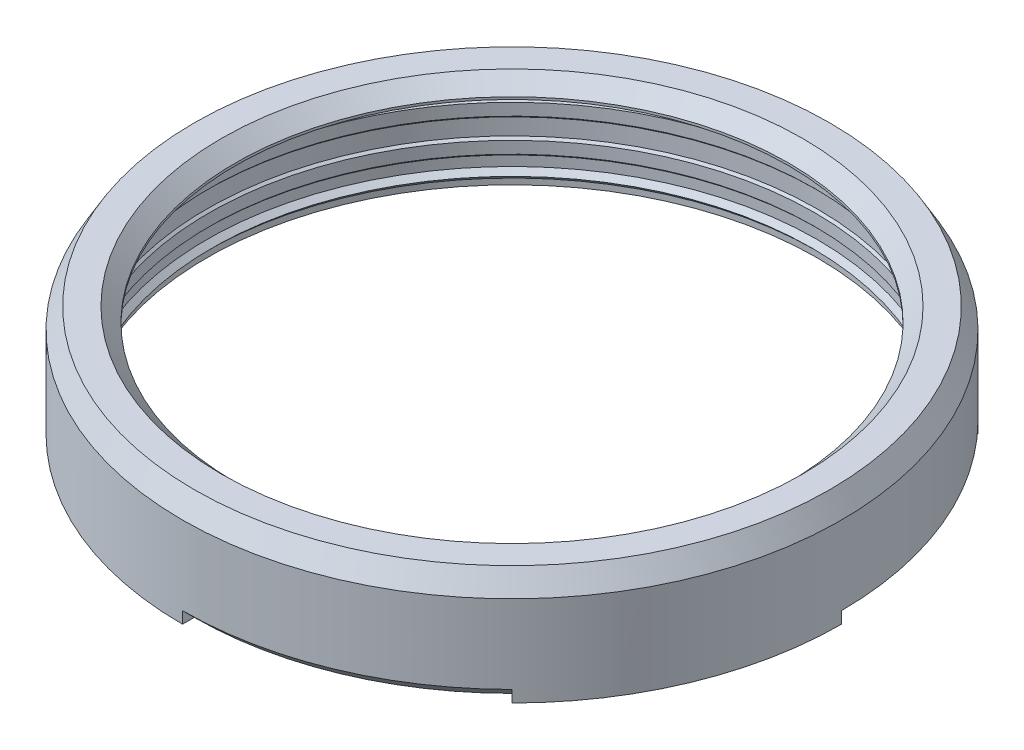
ISO-10303-21;
HEADER;
FILE_DESCRIPTION(('STEP AP214'),'2;1');
FILE_NAME('part.step','',(''),(''),'','','');
FILE_SCHEMA(('AUTOMOTIVE_DESIGN { 1 0 10303 214 1 1 1 1 }'));
ENDSEC;
DATA;
#1=APPLICATION_CONTEXT('core data for automotive mechanical design processes');
#2=APPLICATION_PROTOCOL_DEFINITION('international standard','automotive_design',2000,#1);
#3=PRODUCT_CONTEXT('',#1,'mechanical');
#4=PRODUCT('Part','Part','',(#3));
#5=PRODUCT_RELATED_PRODUCT_CATEGORY('part','',(#4));
#6=PRODUCT_DEFINITION_FORMATION('','',#4);
#7=PRODUCT_DEFINITION_CONTEXT('part definition',#1,'design');
#8=PRODUCT_DEFINITION('design','',#6,#7);
#9=PRODUCT_DEFINITION_SHAPE('','',#8);
#10=(LENGTH_UNIT() NAMED_UNIT(*) SI_UNIT(.MILLI.,.METRE.));
#11=(NAMED_UNIT(*) PLANE_ANGLE_UNIT() SI_UNIT($,.RADIAN.));
#12=(NAMED_UNIT(*) SI_UNIT($,.STERADIAN.) SOLID_ANGLE_UNIT());
#13=UNCERTAINTY_MEASURE_WITH_UNIT(LENGTH_MEASURE(1.E-05),#10,'distance_accuracy_value','');
#14=(GEOMETRIC_REPRESENTATION_CONTEXT(3) GLOBAL_UNCERTAINTY_ASSIGNED_CONTEXT((#13)) GLOBAL_UNIT_ASSIGNED_CONTEXT((#10,
#11,#12)) REPRESENTATION_CONTEXT('',''));
#15=CARTESIAN_POINT('',(0.,0.,0.));
#16=DIRECTION('',(0.,0.,1.));
#17=DIRECTION('',(1.,0.,0.));
#18=AXIS2_PLACEMENT_3D('',#15,#16,#17);
#19=CARTESIAN_POINT('',(0.,-1.39999999999982,0.));
#20=DIRECTION('',(0.,-1.,0.));
#21=DIRECTION('',(0.,0.,-1.));
#22=AXIS2_PLACEMENT_3D('',#19,#20,#21);
#23=TOROIDAL_SURFACE('',#22,24.5300000000004,1.39999999999979);
#24=CARTESIAN_POINT('',(0.,-1.39999999999982,0.));
#25=DIRECTION('',(0.,-1.,0.));
#26=DIRECTION('',(0.,0.,-1.));
#27=AXIS2_PLACEMENT_3D('',#24,#25,#26);
#28=CIRCLE('',#27,25.9300000000002);
#29=CARTESIAN_POINT('',(0.,-1.39999999999982,-25.9300000000002));
#30=VERTEX_POINT('',#29);
#31=EDGE_CURVE('E221',#30,#30,#28,.T.);
#32=ORIENTED_EDGE('',*,*,#31,.T.);
#33=EDGE_LOOP('',(#32));
#34=FACE_BOUND('',#33,.T.);
#35=CARTESIAN_POINT('',(0.,-0.0225022686043711,0.));
#36=DIRECTION('',(0.,-1.,0.));
#37=DIRECTION('',(0.,0.,-1.));
#38=AXIS2_PLACEMENT_3D('',#35,#36,#37);
#39=CIRCLE('',#38,24.78);
#40=CARTESIAN_POINT('',(0.,-0.0225022686043708,-24.78));
#41=VERTEX_POINT('',#40);
#42=EDGE_CURVE('E44',#41,#41,#39,.F.);
#43=ORIENTED_EDGE('',*,*,#42,.T.);
#44=EDGE_LOOP('',(#43));
#45=FACE_BOUND('',#44,.T.);
#46=ADVANCED_FACE('F39',(#34,#45),#23,.F.);
#47=CARTESIAN_POINT('',(0.,0.,0.));
#48=DIRECTION('',(0.,1.,0.));
#49=DIRECTION('',(0.,0.,1.));
#50=AXIS2_PLACEMENT_3D('',#47,#48,#49);
#51=PLANE('',#50);
#52=CARTESIAN_POINT('',(0.,0.,0.));
#53=DIRECTION('',(0.,1.,0.));
#54=DIRECTION('',(0.,0.,1.));
#55=AXIS2_PLACEMENT_3D('',#52,#53,#54);
#56=CIRCLE('',#55,23.5);
#57=CARTESIAN_POINT('',(0.,0.,23.5));
#58=VERTEX_POINT('',#57);
#59=EDGE_CURVE('E220',#58,#58,#56,.T.);
#60=ORIENTED_EDGE('',*,*,#59,.T.);
#61=EDGE_LOOP('',(#60));
#62=FACE_BOUND('',#61,.T.);
#63=CARTESIAN_POINT('',(0.,0.,0.));
#64=DIRECTION('',(0.,-1.,0.));
#65=DIRECTION('',(0.,0.,-1.));
#66=AXIS2_PLACEMENT_3D('',#63,#64,#65);
#67=CIRCLE('',#66,24.32);
#68=CARTESIAN_POINT('',(0.,0.,-24.32));
#69=VERTEX_POINT('',#68);
#70=EDGE_CURVE('E404',#69,#69,#67,.T.);
#71=ORIENTED_EDGE('',*,*,#70,.T.);
#72=EDGE_LOOP('',(#71));
#73=FACE_BOUND('',#72,.T.);
#74=ADVANCED_FACE('F293',(#62,#73),#51,.F.);
#75=CARTESIAN_POINT('',(0.,2.,0.));
#76=DIRECTION('',(0.,-1.,0.));
#77=DIRECTION('',(0.,0.,-1.));
#78=AXIS2_PLACEMENT_3D('',#75,#76,#77);
#79=CYLINDRICAL_SURFACE('',#78,28.);
#80=CARTESIAN_POINT('',(0.,-0.331999999999997,0.));
#81=DIRECTION('',(0.,1.,0.));
#82=DIRECTION('',(0.,0.,1.));
#83=AXIS2_PLACEMENT_3D('',#80,#81,#82);
#84=CIRCLE('',#83,28.);
#85=CARTESIAN_POINT('',(0.,-0.331999999999997,28.));
#86=VERTEX_POINT('',#85);
#87=EDGE_CURVE('E11',#86,#86,#84,.F.);
#88=ORIENTED_EDGE('',*,*,#87,.T.);
#89=EDGE_LOOP('',(#88));
#90=FACE_BOUND('',#89,.T.);
#91=DIRECTION('',(0.,1.,0.));
#92=VECTOR('',#91,1.);
#93=CARTESIAN_POINT('',(-19.7989898732232,-7.99999999999999,-19.7989898732235));
#94=LINE('',#93,#92);
#95=CARTESIAN_POINT('',(-19.7989898732232,-7.99999999999999,-19.7989898732235));
#96=VERTEX_POINT('',#95);
#97=CARTESIAN_POINT('',(-19.7989898732232,-6.99999999999999,-19.7989898732235));
#98=VERTEX_POINT('',#97);
#99=EDGE_CURVE('E136',#96,#98,#94,.T.);
#100=ORIENTED_EDGE('',*,*,#99,.F.);
#101=CARTESIAN_POINT('',(0.,-7.99999999999999,0.));
#102=DIRECTION('',(0.,-1.,0.));
#103=DIRECTION('',(0.,0.,-1.));
#104=AXIS2_PLACEMENT_3D('',#101,#102,#103);
#105=CIRCLE('',#104,28.0000000000001);
#106=CARTESIAN_POINT('',(-28.0000000000001,-7.99999999999999,0.));
#107=VERTEX_POINT('',#106);
#108=EDGE_CURVE('E371',#107,#96,#105,.T.);
#109=ORIENTED_EDGE('',*,*,#108,.F.);
#110=DIRECTION('',(0.,1.,0.));
#111=VECTOR('',#110,1.);
#112=CARTESIAN_POINT('',(-28.,-7.99999999999999,0.));
#113=LINE('',#112,#111);
#114=CARTESIAN_POINT('',(-28.,-6.99999999999999,0.));
#115=VERTEX_POINT('',#114);
#116=EDGE_CURVE('E64',#107,#115,#113,.T.);
#117=ORIENTED_EDGE('',*,*,#116,.T.);
#118=CARTESIAN_POINT('',(0.,-6.99999999999999,0.));
#119=DIRECTION('',(0.,-1.,0.));
#120=DIRECTION('',(0.,0.,1.));
#121=AXIS2_PLACEMENT_3D('',#118,#119,#120);
#122=CIRCLE('',#121,28.);
#123=CARTESIAN_POINT('',(-19.7989898732233,-6.99999999999999,19.7989898732234));
#124=VERTEX_POINT('',#123);
#125=EDGE_CURVE('E144',#124,#115,#122,.T.);
#126=ORIENTED_EDGE('',*,*,#125,.F.);
#127=DIRECTION('',(0.,1.,0.));
#128=VECTOR('',#127,1.);
#129=CARTESIAN_POINT('',(-19.7989898732233,-7.99999999999999,19.7989898732234));
#130=LINE('',#129,#128);
#131=CARTESIAN_POINT('',(-19.7989898732233,-7.99999999999999,19.7989898732234));
#132=VERTEX_POINT('',#131);
#133=EDGE_CURVE('E150',#132,#124,#130,.T.);
#134=ORIENTED_EDGE('',*,*,#133,.F.);
#135=CARTESIAN_POINT('',(0.,-7.99999999999999,28.0000000000001));
#136=VERTEX_POINT('',#135);
#137=EDGE_CURVE('E265',#136,#132,#105,.T.);
#138=ORIENTED_EDGE('',*,*,#137,.F.);
#139=DIRECTION('',(0.,1.,0.));
#140=VECTOR('',#139,1.);
#141=CARTESIAN_POINT('',(0.,-7.99999999999999,28.));
#142=LINE('',#141,#140);
#143=CARTESIAN_POINT('',(0.,-6.99999999999999,28.));
#144=VERTEX_POINT('',#143);
#145=EDGE_CURVE('E182',#136,#144,#142,.T.);
#146=ORIENTED_EDGE('',*,*,#145,.T.);
#147=CARTESIAN_POINT('',(0.,-6.99999999999999,0.));
#148=DIRECTION('',(0.,-1.,0.));
#149=DIRECTION('',(1.,0.,0.));
#150=AXIS2_PLACEMENT_3D('',#147,#148,#149);
#151=CIRCLE('',#150,28.);
#152=CARTESIAN_POINT('',(19.7989898732233,-6.99999999999999,19.7989898732234));
#153=VERTEX_POINT('',#152);
#154=EDGE_CURVE('E187',#153,#144,#151,.T.);
#155=ORIENTED_EDGE('',*,*,#154,.F.);
#156=DIRECTION('',(0.,1.,0.));
#157=VECTOR('',#156,1.);
#158=CARTESIAN_POINT('',(19.7989898732233,-7.99999999999999,19.7989898732234));
#159=LINE('',#158,#157);
#160=CARTESIAN_POINT('',(19.7989898732233,-7.99999999999999,19.7989898732234));
#161=VERTEX_POINT('',#160);
#162=EDGE_CURVE('E195',#161,#153,#159,.T.);
#163=ORIENTED_EDGE('',*,*,#162,.F.);
#164=CARTESIAN_POINT('',(28.0000000000001,-7.99999999999999,0.));
#165=VERTEX_POINT('',#164);
#166=EDGE_CURVE('E261',#165,#161,#105,.T.);
#167=ORIENTED_EDGE('',*,*,#166,.F.);
#168=DIRECTION('',(0.,1.,0.));
#169=VECTOR('',#168,1.);
#170=CARTESIAN_POINT('',(28.,-7.99999999999999,0.));
#171=LINE('',#170,#169);
#172=CARTESIAN_POINT('',(28.,-6.99999999999999,0.));
#173=VERTEX_POINT('',#172);
#174=EDGE_CURVE('E201',#165,#173,#171,.T.);
#175=ORIENTED_EDGE('',*,*,#174,.T.);
#176=CARTESIAN_POINT('',(0.,-6.99999999999999,0.));
#177=DIRECTION('',(0.,-1.,0.));
#178=DIRECTION('',(0.,0.,-1.));
#179=AXIS2_PLACEMENT_3D('',#176,#177,#178);
#180=CIRCLE('',#179,28.);
#181=CARTESIAN_POINT('',(19.7989898732233,-6.99999999999999,-19.7989898732234));
#182=VERTEX_POINT('',#181);
#183=EDGE_CURVE('E218',#182,#173,#180,.T.);
#184=ORIENTED_EDGE('',*,*,#183,.F.);
#185=DIRECTION('',(0.,1.,0.));
#186=VECTOR('',#185,1.);
#187=CARTESIAN_POINT('',(19.7989898732233,-7.99999999999999,-19.7989898732234));
#188=LINE('',#187,#186);
#189=CARTESIAN_POINT('',(19.7989898732233,-7.99999999999999,-19.7989898732234));
#190=VERTEX_POINT('',#189);
#191=EDGE_CURVE('E210',#190,#182,#188,.T.);
#192=ORIENTED_EDGE('',*,*,#191,.F.);
#193=CARTESIAN_POINT('',(2.91721445650619E-13,-7.99999999999999,-28.0000000000001));
#194=VERTEX_POINT('',#193);
#195=EDGE_CURVE('E260',#194,#190,#105,.T.);
#196=ORIENTED_EDGE('',*,*,#195,.F.);
#197=DIRECTION('',(0.,1.,0.));
#198=VECTOR('',#197,1.);
#199=CARTESIAN_POINT('',(2.93284432462823E-13,-7.99999999999999,-28.));
#200=LINE('',#199,#198);
#201=CARTESIAN_POINT('',(2.93284432462823E-13,-6.99999999999999,-28.));
#202=VERTEX_POINT('',#201);
#203=EDGE_CURVE('E56',#194,#202,#200,.T.);
#204=ORIENTED_EDGE('',*,*,#203,.T.);
#205=CARTESIAN_POINT('',(0.,-6.99999999999999,0.));
#206=DIRECTION('',(0.,-1.,0.));
#207=DIRECTION('',(-1.,0.,0.));
#208=AXIS2_PLACEMENT_3D('',#205,#206,#207);
#209=CIRCLE('',#208,28.);
#210=EDGE_CURVE('E167',#98,#202,#209,.T.);
#211=ORIENTED_EDGE('',*,*,#210,.F.);
#212=EDGE_LOOP('',(#100,#109,#117,#126,#134,#138,#146,#155,#163,#167,#175,#184,#192,#196,#204,#211));
#213=FACE_BOUND('',#212,.T.);
#214=ADVANCED_FACE('F301',(#90,#213),#79,.T.);
#215=CARTESIAN_POINT('',(-27.1682803357279,-7.99999999999999,-6.77381307679085));
#216=DIRECTION('',(0.,-1.,0.));
#217=DIRECTION('',(0.,0.,-1.));
#218=AXIS2_PLACEMENT_3D('',#215,#216,#217);
#219=PLANE('',#218);
#220=CARTESIAN_POINT('',(0.,-7.99999999999999,0.));
#221=DIRECTION('',(0.,-1.,0.));
#222=DIRECTION('',(0.,0.,-1.));
#223=AXIS2_PLACEMENT_3D('',#220,#221,#222);
#224=CIRCLE('',#223,25.9300000000002);
#225=CARTESIAN_POINT('',(0.,-7.99999999999999,-25.9300000000002));
#226=VERTEX_POINT('',#225);
#227=EDGE_CURVE('E257',#226,#226,#224,.T.);
#228=ORIENTED_EDGE('',*,*,#227,.F.);
#229=EDGE_LOOP('',(#228));
#230=FACE_BOUND('',#229,.T.);
#231=ORIENTED_EDGE('',*,*,#108,.T.);
#232=DIRECTION('',(-0.707106781186541,0.,-0.707106781186554));
#233=VECTOR('',#232,1.);
#234=CARTESIAN_POINT('',(-19.0918830920366,-7.99999999999999,-19.091883092037));
#235=LINE('',#234,#233);
#236=CARTESIAN_POINT('',(-19.0918830920366,-7.99999999999999,-19.091883092037));
#237=VERTEX_POINT('',#236);
#238=EDGE_CURVE('E173',#237,#96,#235,.T.);
#239=ORIENTED_EDGE('',*,*,#238,.F.);
#240=CARTESIAN_POINT('',(0.,-7.99999999999999,0.));
#241=DIRECTION('',(0.,-1.,0.));
#242=DIRECTION('',(-1.,0.,0.));
#243=AXIS2_PLACEMENT_3D('',#240,#241,#242);
#244=CIRCLE('',#243,27.);
#245=CARTESIAN_POINT('',(2.82809988446294E-13,-7.99999999999999,-27.));
#246=VERTEX_POINT('',#245);
#247=EDGE_CURVE('E170',#237,#246,#244,.T.);
#248=ORIENTED_EDGE('',*,*,#247,.T.);
#249=DIRECTION('',(0.,0.,-1.));
#250=VECTOR('',#249,1.);
#251=CARTESIAN_POINT('',(2.82809988446294E-13,-7.99999999999999,-27.));
#252=LINE('',#251,#250);
#253=EDGE_CURVE('E159',#246,#194,#252,.T.);
#254=ORIENTED_EDGE('',*,*,#253,.T.);
#255=ORIENTED_EDGE('',*,*,#195,.T.);
#256=DIRECTION('',(0.707106781186546,0.,-0.707106781186549));
#257=VECTOR('',#256,1.);
#258=CARTESIAN_POINT('',(19.0918830920367,-7.99999999999999,-19.0918830920368));
#259=LINE('',#258,#257);
#260=CARTESIAN_POINT('',(19.0918830920367,-7.99999999999999,-19.0918830920368));
#261=VERTEX_POINT('',#260);
#262=EDGE_CURVE('E207',#261,#190,#259,.T.);
#263=ORIENTED_EDGE('',*,*,#262,.F.);
#264=CARTESIAN_POINT('',(0.,-7.99999999999999,0.));
#265=DIRECTION('',(0.,-1.,0.));
#266=DIRECTION('',(0.,0.,-1.));
#267=AXIS2_PLACEMENT_3D('',#264,#265,#266);
#268=CIRCLE('',#267,27.);
#269=CARTESIAN_POINT('',(27.,-7.99999999999999,0.));
#270=VERTEX_POINT('',#269);
#271=EDGE_CURVE('E215',#261,#270,#268,.T.);
#272=ORIENTED_EDGE('',*,*,#271,.T.);
#273=DIRECTION('',(1.,0.,0.));
#274=VECTOR('',#273,1.);
#275=CARTESIAN_POINT('',(27.,-7.99999999999999,0.));
#276=LINE('',#275,#274);
#277=EDGE_CURVE('E198',#270,#165,#276,.T.);
#278=ORIENTED_EDGE('',*,*,#277,.T.);
#279=ORIENTED_EDGE('',*,*,#166,.T.);
#280=DIRECTION('',(0.707106781186546,0.,0.707106781186549));
#281=VECTOR('',#280,1.);
#282=CARTESIAN_POINT('',(19.0918830920367,-7.99999999999999,19.0918830920368));
#283=LINE('',#282,#281);
#284=CARTESIAN_POINT('',(19.0918830920367,-7.99999999999999,19.0918830920368));
#285=VERTEX_POINT('',#284);
#286=EDGE_CURVE('E193',#285,#161,#283,.T.);
#287=ORIENTED_EDGE('',*,*,#286,.F.);
#288=CARTESIAN_POINT('',(0.,-7.99999999999999,0.));
#289=DIRECTION('',(0.,-1.,0.));
#290=DIRECTION('',(1.,0.,0.));
#291=AXIS2_PLACEMENT_3D('',#288,#289,#290);
#292=CIRCLE('',#291,27.);
#293=CARTESIAN_POINT('',(0.,-7.99999999999999,27.));
#294=VERTEX_POINT('',#293);
#295=EDGE_CURVE('E190',#285,#294,#292,.T.);
#296=ORIENTED_EDGE('',*,*,#295,.T.);
#297=DIRECTION('',(0.,0.,1.));
#298=VECTOR('',#297,1.);
#299=CARTESIAN_POINT('',(0.,-7.99999999999999,27.));
#300=LINE('',#299,#298);
#301=EDGE_CURVE('E158',#294,#136,#300,.T.);
#302=ORIENTED_EDGE('',*,*,#301,.T.);
#303=ORIENTED_EDGE('',*,*,#137,.T.);
#304=DIRECTION('',(-0.707106781186546,0.,0.707106781186549));
#305=VECTOR('',#304,1.);
#306=CARTESIAN_POINT('',(-19.0918830920367,-7.99999999999999,19.0918830920368));
#307=LINE('',#306,#305);
#308=CARTESIAN_POINT('',(-19.0918830920367,-7.99999999999999,19.0918830920368));
#309=VERTEX_POINT('',#308);
#310=EDGE_CURVE('E148',#309,#132,#307,.T.);
#311=ORIENTED_EDGE('',*,*,#310,.F.);
#312=CARTESIAN_POINT('',(0.,-7.99999999999999,0.));
#313=DIRECTION('',(0.,-1.,0.));
#314=DIRECTION('',(0.,0.,1.));
#315=AXIS2_PLACEMENT_3D('',#312,#313,#314);
#316=CIRCLE('',#315,27.);
#317=CARTESIAN_POINT('',(-27.,-7.99999999999999,0.));
#318=VERTEX_POINT('',#317);
#319=EDGE_CURVE('E141',#309,#318,#316,.T.);
#320=ORIENTED_EDGE('',*,*,#319,.T.);
#321=DIRECTION('',(-1.,0.,0.));
#322=VECTOR('',#321,1.);
#323=CARTESIAN_POINT('',(-27.,-7.99999999999999,0.));
#324=LINE('',#323,#322);
#325=EDGE_CURVE('E127',#318,#107,#324,.T.);
#326=ORIENTED_EDGE('',*,*,#325,.T.);
#327=EDGE_LOOP('',(#231,#239,#248,#254,#255,#263,#272,#278,#279,#287,#296,#302,#303,#311,#320,#326));
#328=FACE_BOUND('',#327,.T.);
#329=ADVANCED_FACE('F146',(#230,#328),#219,.T.);
#330=CARTESIAN_POINT('',(0.,-7.99999999999999,0.));
#331=DIRECTION('',(0.,1.,0.));
#332=DIRECTION('',(0.,0.,1.));
#333=AXIS2_PLACEMENT_3D('',#330,#331,#332);
#334=CYLINDRICAL_SURFACE('',#333,23.5);
#335=CARTESIAN_POINT('',(0.,0.200000000000021,0.));
#336=DIRECTION('',(0.,1.,0.));
#337=DIRECTION('',(0.,0.,1.));
#338=AXIS2_PLACEMENT_3D('',#335,#336,#337);
#339=CIRCLE('',#338,23.5);
#340=CARTESIAN_POINT('',(0.,0.20000000000002,23.5));
#341=VERTEX_POINT('',#340);
#342=EDGE_CURVE('E270',#341,#341,#339,.T.);
#343=CARTESIAN_POINT('',(0.,0.20000000000002,23.5));
#344=CARTESIAN_POINT('',(0.,0.197916666666686,23.5));
#345=CARTESIAN_POINT('',(0.,0.195833333333352,23.5));
#346=CARTESIAN_POINT('',(0.,0.191666666666685,23.5));
#347=CARTESIAN_POINT('',(0.,0.189583333333351,23.5));
#348=CARTESIAN_POINT('',(0.,0.185416666666684,23.5));
#349=CARTESIAN_POINT('',(0.,0.183333333333351,23.5));
#350=CARTESIAN_POINT('',(0.,0.179166666666685,23.5));
#351=CARTESIAN_POINT('',(0.,0.177083333333351,23.5));
#352=CARTESIAN_POINT('',(0.,0.172916666666683,23.5));
#353=CARTESIAN_POINT('',(0.,0.17083333333335,23.5));
#354=CARTESIAN_POINT('',(0.,0.166666666666683,23.5));
#355=CARTESIAN_POINT('',(0.,0.16458333333335,23.5));
#356=CARTESIAN_POINT('',(0.,0.160416666666683,23.5));
#357=CARTESIAN_POINT('',(0.,0.158333333333349,23.5));
#358=CARTESIAN_POINT('',(0.,0.154166666666682,23.5));
#359=CARTESIAN_POINT('',(0.,0.152083333333348,23.5));
#360=CARTESIAN_POINT('',(0.,0.147916666666681,23.5));
#361=CARTESIAN_POINT('',(0.,0.145833333333347,23.5));
#362=CARTESIAN_POINT('',(0.,0.14166666666668,23.5));
#363=CARTESIAN_POINT('',(0.,0.139583333333346,23.5));
#364=CARTESIAN_POINT('',(0.,0.13541666666668,23.5));
#365=CARTESIAN_POINT('',(0.,0.133333333333346,23.5));
#366=CARTESIAN_POINT('',(0.,0.12916666666668,23.5));
#367=CARTESIAN_POINT('',(0.,0.127083333333346,23.5));
#368=CARTESIAN_POINT('',(0.,0.122916666666679,23.5));
#369=CARTESIAN_POINT('',(0.,0.120833333333345,23.5));
#370=CARTESIAN_POINT('',(0.,0.116666666666678,23.5));
#371=CARTESIAN_POINT('',(0.,0.114583333333345,23.5));
#372=CARTESIAN_POINT('',(0.,0.110416666666678,23.5));
#373=CARTESIAN_POINT('',(0.,0.108333333333345,23.5));
#374=CARTESIAN_POINT('',(0.,0.104166666666677,23.5));
#375=CARTESIAN_POINT('',(0.,0.102083333333343,23.5));
#376=CARTESIAN_POINT('',(0.,0.0979166666666761,23.5));
#377=CARTESIAN_POINT('',(0.,0.0958333333333424,23.5));
#378=CARTESIAN_POINT('',(0.,0.0916666666666751,23.5));
#379=CARTESIAN_POINT('',(0.,0.0895833333333414,23.5));
#380=CARTESIAN_POINT('',(0.,0.0854166666666746,23.5));
#381=CARTESIAN_POINT('',(0.,0.0833333333333415,23.5));
#382=CARTESIAN_POINT('',(0.,0.0791666666666747,23.5));
#383=CARTESIAN_POINT('',(0.,0.077083333333341,23.5));
#384=CARTESIAN_POINT('',(0.,0.0729166666666737,23.5));
#385=CARTESIAN_POINT('',(0.,0.07083333333334,23.5));
#386=CARTESIAN_POINT('',(0.,0.0666666666666732,23.5));
#387=CARTESIAN_POINT('',(0.,0.0645833333333401,23.5));
#388=CARTESIAN_POINT('',(0.,0.0604166666666733,23.5));
#389=CARTESIAN_POINT('',(0.,0.0583333333333396,23.5));
#390=CARTESIAN_POINT('',(0.,0.0541666666666723,23.5));
#391=CARTESIAN_POINT('',(0.,0.0520833333333386,23.5));
#392=CARTESIAN_POINT('',(0.,0.0479166666666712,23.5));
#393=CARTESIAN_POINT('',(0.,0.0458333333333375,23.5));
#394=CARTESIAN_POINT('',(0.,0.0416666666666702,23.5));
#395=CARTESIAN_POINT('',(0.,0.0395833333333365,23.5));
#396=CARTESIAN_POINT('',(0.,0.0354166666666697,23.5));
#397=CARTESIAN_POINT('',(0.,0.0333333333333366,23.5));
#398=CARTESIAN_POINT('',(0.,0.0291666666666698,23.5));
#399=CARTESIAN_POINT('',(0.,0.0270833333333361,23.5));
#400=CARTESIAN_POINT('',(0.,0.0229166666666688,23.5));
#401=CARTESIAN_POINT('',(0.,0.0208333333333351,23.5));
#402=CARTESIAN_POINT('',(0.,0.0166666666666683,23.5));
#403=CARTESIAN_POINT('',(0.,0.0145833333333352,23.5));
#404=CARTESIAN_POINT('',(0.,0.0104166666666684,23.5));
#405=CARTESIAN_POINT('',(0.,0.00833333333333473,23.5));
#406=CARTESIAN_POINT('',(0.,0.00416666666666736,23.5));
#407=CARTESIAN_POINT('',(0.,0.00208333333333368,23.5));
#408=CARTESIAN_POINT('',(0.,0.,23.5));
#409=B_SPLINE_CURVE_WITH_KNOTS('',3,(#343,#344,#345,#346,#347,#348,#349,#350,#351,#352,#353,
#354,#355,#356,#357,#358,#359,#360,#361,#362,#363,#364,#365,#366,#367,#368,#369,#370,#371,#372,
#373,#374,#375,#376,#377,#378,#379,#380,#381,#382,#383,#384,#385,#386,#387,#388,#389,#390,#391,
#392,#393,#394,#395,#396,#397,#398,#399,#400,#401,#402,#403,#404,#405,#406,#407,#408),
.UNSPECIFIED.,.F.,.F.,(4,2,2,2,2,2,2,2,2,2,2,2,2,2,2,2,2,2,2,2,2,2,2,2,2,2,2,2,2,2,2,2,4),(0.,
0.00625000000000105,0.0125000000000021,0.0187500000000014,0.0250000000000025,0.0312500000000035,
0.0375000000000028,0.0437500000000039,0.0500000000000049,0.0562500000000059,0.062500000000007,
0.0687500000000063,0.0750000000000074,0.0812500000000084,0.0875000000000077,0.0937500000000088,
0.10000000000001,0.106250000000011,0.112500000000012,0.118750000000011,0.125000000000012,
0.131250000000013,0.137500000000013,0.143750000000014,0.150000000000015,0.156250000000016,
0.162500000000017,0.168750000000016,0.175000000000017,0.181250000000018,0.187500000000018,
0.193750000000019,0.20000000000002),.UNSPECIFIED.);
#410=EDGE_CURVE('BSEAM307',#341,#58,#409,.T.);
#411=ORIENTED_EDGE('',*,*,#342,.T.);
#412=ORIENTED_EDGE('',*,*,#59,.F.);
#413=ORIENTED_EDGE('',*,*,#410,.T.);
#414=ORIENTED_EDGE('',*,*,#410,.F.);
#415=EDGE_LOOP('',(#411,#413,#412,#414));
#416=FACE_BOUND('',#415,.T.);
#417=ADVANCED_FACE('F307',(#416),#334,.F.);
#418=CARTESIAN_POINT('',(0.,0.,0.));
#419=DIRECTION('',(0.,-1.,0.));
#420=DIRECTION('',(0.,0.,-1.));
#421=AXIS2_PLACEMENT_3D('',#418,#419,#420);
#422=CYLINDRICAL_SURFACE('',#421,25.9300000000002);
#423=ORIENTED_EDGE('',*,*,#227,.T.);
#424=EDGE_LOOP('',(#423));
#425=FACE_BOUND('',#424,.T.);
#426=CARTESIAN_POINT('',(0.,-7.49999999999998,0.));
#427=DIRECTION('',(0.,-1.,0.));
#428=DIRECTION('',(0.,0.,-1.));
#429=AXIS2_PLACEMENT_3D('',#426,#427,#428);
#430=CIRCLE('',#429,25.9300000000002);
#431=CARTESIAN_POINT('',(0.,-7.49999999999998,-25.9300000000002));
#432=VERTEX_POINT('',#431);
#433=EDGE_CURVE('E254',#432,#432,#430,.T.);
#434=ORIENTED_EDGE('',*,*,#433,.F.);
#435=EDGE_LOOP('',(#434));
#436=FACE_BOUND('',#435,.T.);
#437=ADVANCED_FACE('F352',(#425,#436),#422,.F.);
#438=CARTESIAN_POINT('',(0.,-7.07499999999983,0.));
#439=DIRECTION('',(0.,-1.,0.));
#440=DIRECTION('',(0.,0.,-1.));
#441=AXIS2_PLACEMENT_3D('',#438,#439,#440);
#442=CONICAL_SURFACE('',#441,25.505,0.78539816339751);
#443=ORIENTED_EDGE('',*,*,#433,.T.);
#444=EDGE_LOOP('',(#443));
#445=FACE_BOUND('',#444,.T.);
#446=CARTESIAN_POINT('',(0.,-7.07499999999983,0.));
#447=DIRECTION('',(0.,-1.,0.));
#448=DIRECTION('',(0.,0.,-1.));
#449=AXIS2_PLACEMENT_3D('',#446,#447,#448);
#450=CIRCLE('',#449,25.505);
#451=CARTESIAN_POINT('',(0.,-7.07499999999983,-25.505));
#452=VERTEX_POINT('',#451);
#453=EDGE_CURVE('E251',#452,#452,#450,.T.);
#454=ORIENTED_EDGE('',*,*,#453,.F.);
#455=EDGE_LOOP('',(#454));
#456=FACE_BOUND('',#455,.T.);
#457=ADVANCED_FACE('F348',(#445,#456),#442,.F.);
#458=CARTESIAN_POINT('',(0.,-6.64999999999958,0.));
#459=DIRECTION('',(0.,1.,0.));
#460=DIRECTION('',(0.,0.,1.));
#461=AXIS2_PLACEMENT_3D('',#458,#459,#460);
#462=CONICAL_SURFACE('',#461,25.9300000000002,0.785398163397391);
#463=ORIENTED_EDGE('',*,*,#453,.T.);
#464=EDGE_LOOP('',(#463));
#465=FACE_BOUND('',#464,.T.);
#466=CARTESIAN_POINT('',(0.,-6.64999999999958,0.));
#467=DIRECTION('',(0.,-1.,0.));
#468=DIRECTION('',(0.,0.,-1.));
#469=AXIS2_PLACEMENT_3D('',#466,#467,#468);
#470=CIRCLE('',#469,25.9300000000002);
#471=CARTESIAN_POINT('',(0.,-6.64999999999958,-25.9300000000002));
#472=VERTEX_POINT('',#471);
#473=EDGE_CURVE('E248',#472,#472,#470,.T.);
#474=ORIENTED_EDGE('',*,*,#473,.F.);
#475=EDGE_LOOP('',(#474));
#476=FACE_BOUND('',#475,.T.);
#477=ADVANCED_FACE('F344',(#465,#476),#462,.F.);
#478=CARTESIAN_POINT('',(0.,0.,0.));
#479=DIRECTION('',(0.,-1.,0.));
#480=DIRECTION('',(0.,0.,-1.));
#481=AXIS2_PLACEMENT_3D('',#478,#479,#480);
#482=CYLINDRICAL_SURFACE('',#481,25.9300000000002);
#483=ORIENTED_EDGE('',*,*,#473,.T.);
#484=EDGE_LOOP('',(#483));
#485=FACE_BOUND('',#484,.T.);
#486=CARTESIAN_POINT('',(0.,-5.79999999999958,0.));
#487=DIRECTION('',(0.,-1.,0.));
#488=DIRECTION('',(0.,0.,-1.));
#489=AXIS2_PLACEMENT_3D('',#486,#487,#488);
#490=CIRCLE('',#489,25.9300000000002);
#491=CARTESIAN_POINT('',(0.,-5.79999999999958,-25.9300000000002));
#492=VERTEX_POINT('',#491);
#493=EDGE_CURVE('E245',#492,#492,#490,.T.);
#494=ORIENTED_EDGE('',*,*,#493,.F.);
#495=EDGE_LOOP('',(#494));
#496=FACE_BOUND('',#495,.T.);
#497=ADVANCED_FACE('F340',(#485,#496),#482,.F.);
#498=CARTESIAN_POINT('',(0.,-5.6099999999996,0.));
#499=DIRECTION('',(0.,-1.,0.));
#500=DIRECTION('',(0.,0.,-1.));
#501=AXIS2_PLACEMENT_3D('',#498,#499,#500);
#502=CONICAL_SURFACE('',#501,25.7400000000002,0.785398163397517);
#503=ORIENTED_EDGE('',*,*,#493,.T.);
#504=EDGE_LOOP('',(#503));
#505=FACE_BOUND('',#504,.T.);
#506=CARTESIAN_POINT('',(0.,-5.6099999999996,0.));
#507=DIRECTION('',(0.,-1.,0.));
#508=DIRECTION('',(0.,0.,-1.));
#509=AXIS2_PLACEMENT_3D('',#506,#507,#508);
#510=CIRCLE('',#509,25.7400000000002);
#511=CARTESIAN_POINT('',(0.,-5.6099999999996,-25.7400000000002));
#512=VERTEX_POINT('',#511);
#513=EDGE_CURVE('E242',#512,#512,#510,.T.);
#514=ORIENTED_EDGE('',*,*,#513,.F.);
#515=EDGE_LOOP('',(#514));
#516=FACE_BOUND('',#515,.T.);
#517=ADVANCED_FACE('F336',(#505,#516),#502,.F.);
#518=CARTESIAN_POINT('',(0.,0.,0.));
#519=DIRECTION('',(0.,-1.,0.));
#520=DIRECTION('',(0.,0.,-1.));
#521=AXIS2_PLACEMENT_3D('',#518,#519,#520);
#522=CYLINDRICAL_SURFACE('',#521,25.7400000000002);
#523=ORIENTED_EDGE('',*,*,#513,.T.);
#524=EDGE_LOOP('',(#523));
#525=FACE_BOUND('',#524,.T.);
#526=CARTESIAN_POINT('',(0.,-4.58999999999964,0.));
#527=DIRECTION('',(0.,-1.,0.));
#528=DIRECTION('',(0.,0.,-1.));
#529=AXIS2_PLACEMENT_3D('',#526,#527,#528);
#530=CIRCLE('',#529,25.7400000000002);
#531=CARTESIAN_POINT('',(0.,-4.58999999999964,-25.7400000000002));
#532=VERTEX_POINT('',#531);
#533=EDGE_CURVE('E239',#532,#532,#530,.T.);
#534=ORIENTED_EDGE('',*,*,#533,.F.);
#535=EDGE_LOOP('',(#534));
#536=FACE_BOUND('',#535,.T.);
#537=ADVANCED_FACE('F332',(#525,#536),#522,.F.);
#538=CARTESIAN_POINT('',(0.,-4.39999999999961,0.));
#539=DIRECTION('',(0.,1.,0.));
#540=DIRECTION('',(0.,0.,1.));
#541=AXIS2_PLACEMENT_3D('',#538,#539,#540);
#542=CONICAL_SURFACE('',#541,25.9300000000002,0.785398163397405);
#543=ORIENTED_EDGE('',*,*,#533,.T.);
#544=EDGE_LOOP('',(#543));
#545=FACE_BOUND('',#544,.T.);
#546=CARTESIAN_POINT('',(0.,-4.39999999999961,0.));
#547=DIRECTION('',(0.,-1.,0.));
#548=DIRECTION('',(0.,0.,-1.));
#549=AXIS2_PLACEMENT_3D('',#546,#547,#548);
#550=CIRCLE('',#549,25.9300000000002);
#551=CARTESIAN_POINT('',(0.,-4.39999999999961,-25.9300000000002));
#552=VERTEX_POINT('',#551);
#553=EDGE_CURVE('E236',#552,#552,#550,.T.);
#554=ORIENTED_EDGE('',*,*,#553,.F.);
#555=EDGE_LOOP('',(#554));
#556=FACE_BOUND('',#555,.T.);
#557=ADVANCED_FACE('F328',(#545,#556),#542,.F.);
#558=CARTESIAN_POINT('',(0.,0.,0.));
#559=DIRECTION('',(0.,-1.,0.));
#560=DIRECTION('',(0.,0.,-1.));
#561=AXIS2_PLACEMENT_3D('',#558,#559,#560);
#562=CYLINDRICAL_SURFACE('',#561,25.9300000000002);
#563=ORIENTED_EDGE('',*,*,#553,.T.);
#564=EDGE_LOOP('',(#563));
#565=FACE_BOUND('',#564,.T.);
#566=CARTESIAN_POINT('',(0.,-2.99999999999962,0.));
#567=DIRECTION('',(0.,-1.,0.));
#568=DIRECTION('',(0.,0.,-1.));
#569=AXIS2_PLACEMENT_3D('',#566,#567,#568);
#570=CIRCLE('',#569,25.9300000000002);
#571=CARTESIAN_POINT('',(0.,-2.99999999999962,-25.9300000000002));
#572=VERTEX_POINT('',#571);
#573=EDGE_CURVE('E233',#572,#572,#570,.T.);
#574=ORIENTED_EDGE('',*,*,#573,.F.);
#575=EDGE_LOOP('',(#574));
#576=FACE_BOUND('',#575,.T.);
#577=ADVANCED_FACE('F324',(#565,#576),#562,.F.);
#578=CARTESIAN_POINT('',(0.,-2.80999999999964,0.));
#579=DIRECTION('',(0.,-1.,0.));
#580=DIRECTION('',(0.,0.,-1.));
#581=AXIS2_PLACEMENT_3D('',#578,#579,#580);
#582=CONICAL_SURFACE('',#581,25.7400000000002,0.785398163397522);
#583=ORIENTED_EDGE('',*,*,#573,.T.);
#584=EDGE_LOOP('',(#583));
#585=FACE_BOUND('',#584,.T.);
#586=CARTESIAN_POINT('',(0.,-2.80999999999964,0.));
#587=DIRECTION('',(0.,-1.,0.));
#588=DIRECTION('',(0.,0.,-1.));
#589=AXIS2_PLACEMENT_3D('',#586,#587,#588);
#590=CIRCLE('',#589,25.7400000000002);
#591=CARTESIAN_POINT('',(0.,-2.80999999999964,-25.7400000000002));
#592=VERTEX_POINT('',#591);
#593=EDGE_CURVE('E230',#592,#592,#590,.T.);
#594=ORIENTED_EDGE('',*,*,#593,.F.);
#595=EDGE_LOOP('',(#594));
#596=FACE_BOUND('',#595,.T.);
#597=ADVANCED_FACE('F320',(#585,#596),#582,.F.);
#598=CARTESIAN_POINT('',(0.,0.,0.));
#599=DIRECTION('',(0.,-1.,0.));
#600=DIRECTION('',(0.,0.,-1.));
#601=AXIS2_PLACEMENT_3D('',#598,#599,#600);
#602=CYLINDRICAL_SURFACE('',#601,25.7400000000002);
#603=ORIENTED_EDGE('',*,*,#593,.T.);
#604=EDGE_LOOP('',(#603));
#605=FACE_BOUND('',#604,.T.);
#606=CARTESIAN_POINT('',(0.,-1.78999999999963,0.));
#607=DIRECTION('',(0.,-1.,0.));
#608=DIRECTION('',(0.,0.,-1.));
#609=AXIS2_PLACEMENT_3D('',#606,#607,#608);
#610=CIRCLE('',#609,25.7400000000002);
#611=CARTESIAN_POINT('',(0.,-1.78999999999963,-25.7400000000002));
#612=VERTEX_POINT('',#611);
#613=EDGE_CURVE('E227',#612,#612,#610,.T.);
#614=ORIENTED_EDGE('',*,*,#613,.F.);
#615=EDGE_LOOP('',(#614));
#616=FACE_BOUND('',#615,.T.);
#617=ADVANCED_FACE('F316',(#605,#616),#602,.F.);
#618=CARTESIAN_POINT('',(0.,-1.5999999999996,0.));
#619=DIRECTION('',(0.,1.,0.));
#620=DIRECTION('',(0.,0.,1.));
#621=AXIS2_PLACEMENT_3D('',#618,#619,#620);
#622=CONICAL_SURFACE('',#621,25.9300000000002,0.7853981633974);
#623=ORIENTED_EDGE('',*,*,#613,.T.);
#624=EDGE_LOOP('',(#623));
#625=FACE_BOUND('',#624,.T.);
#626=CARTESIAN_POINT('',(0.,-1.5999999999996,0.));
#627=DIRECTION('',(0.,-1.,0.));
#628=DIRECTION('',(0.,0.,-1.));
#629=AXIS2_PLACEMENT_3D('',#626,#627,#628);
#630=CIRCLE('',#629,25.9300000000002);
#631=CARTESIAN_POINT('',(0.,-1.5999999999996,-25.9300000000002));
#632=VERTEX_POINT('',#631);
#633=EDGE_CURVE('E224',#632,#632,#630,.T.);
#634=ORIENTED_EDGE('',*,*,#633,.F.);
#635=EDGE_LOOP('',(#634));
#636=FACE_BOUND('',#635,.T.);
#637=ADVANCED_FACE('F312',(#625,#636),#622,.F.);
#638=CARTESIAN_POINT('',(0.,0.,0.));
#639=DIRECTION('',(0.,-1.,0.));
#640=DIRECTION('',(0.,0.,-1.));
#641=AXIS2_PLACEMENT_3D('',#638,#639,#640);
#642=CYLINDRICAL_SURFACE('',#641,25.9300000000002);
#643=ORIENTED_EDGE('',*,*,#633,.T.);
#644=EDGE_LOOP('',(#643));
#645=FACE_BOUND('',#644,.T.);
#646=ORIENTED_EDGE('',*,*,#31,.F.);
#647=EDGE_LOOP('',(#646));
#648=FACE_BOUND('',#647,.T.);
#649=ADVANCED_FACE('F309',(#645,#648),#642,.F.);
#650=CARTESIAN_POINT('',(0.,1.4,0.));
#651=DIRECTION('',(0.,1.,0.));
#652=DIRECTION('',(0.,0.,1.));
#653=AXIS2_PLACEMENT_3D('',#650,#651,#652);
#654=PLANE('',#653);
#655=CARTESIAN_POINT('',(0.,1.4,0.));
#656=DIRECTION('',(0.,1.,0.));
#657=DIRECTION('',(0.,0.,1.));
#658=AXIS2_PLACEMENT_3D('',#655,#656,#657);
#659=CIRCLE('',#658,27.0000293337636);
#660=CARTESIAN_POINT('',(0.,1.4,27.0000293337636));
#661=VERTEX_POINT('',#660);
#662=EDGE_CURVE('E49',#661,#661,#659,.T.);
#663=ORIENTED_EDGE('',*,*,#662,.T.);
#664=EDGE_LOOP('',(#663));
#665=FACE_BOUND('',#664,.T.);
#666=CARTESIAN_POINT('',(0.,1.4,0.));
#667=DIRECTION('',(0.,1.,0.));
#668=DIRECTION('',(0.,0.,1.));
#669=AXIS2_PLACEMENT_3D('',#666,#667,#668);
#670=CIRCLE('',#669,24.7);
#671=CARTESIAN_POINT('',(0.,1.4,24.7));
#672=VERTEX_POINT('',#671);
#673=EDGE_CURVE('E264',#672,#672,#670,.F.);
#674=ORIENTED_EDGE('',*,*,#673,.T.);
#675=EDGE_LOOP('',(#674));
#676=FACE_BOUND('',#675,.T.);
#677=ADVANCED_FACE('F276',(#665,#676),#654,.T.);
#678=CARTESIAN_POINT('',(0.,1.4,0.));
#679=DIRECTION('',(0.,1.,0.));
#680=DIRECTION('',(0.,0.,1.));
#681=AXIS2_PLACEMENT_3D('',#678,#679,#680);
#682=CONICAL_SURFACE('',#681,24.7,0.785398163397445);
#683=ORIENTED_EDGE('',*,*,#342,.F.);
#684=EDGE_LOOP('',(#683));
#685=FACE_BOUND('',#684,.T.);
#686=ORIENTED_EDGE('',*,*,#673,.F.);
#687=EDGE_LOOP('',(#686));
#688=FACE_BOUND('',#687,.T.);
#689=ADVANCED_FACE('F281',(#685,#688),#682,.F.);
#690=CARTESIAN_POINT('',(0.,1.4,0.));
#691=DIRECTION('',(0.,-1.,0.));
#692=DIRECTION('',(0.,0.,-1.));
#693=AXIS2_PLACEMENT_3D('',#690,#691,#692);
#694=CONICAL_SURFACE('',#693,27.0000293337636,0.523598775598294);
#695=ORIENTED_EDGE('',*,*,#87,.F.);
#696=EDGE_LOOP('',(#695));
#697=FACE_BOUND('',#696,.T.);
#698=ORIENTED_EDGE('',*,*,#662,.F.);
#699=EDGE_LOOP('',(#698));
#700=FACE_BOUND('',#699,.T.);
#701=ADVANCED_FACE('F42',(#697,#700),#694,.T.);
#702=CARTESIAN_POINT('',(0.,-6.99999999999999,0.));
#703=DIRECTION('',(0.,1.,0.));
#704=DIRECTION('',(0.,0.,1.));
#705=AXIS2_PLACEMENT_3D('',#702,#703,#704);
#706=CONICAL_SURFACE('',#705,28.,0.785398163397452);
#707=DIRECTION('',(-0.5,-0.707106781186546,0.500000000000002));
#708=VECTOR('',#707,1.);
#709=CARTESIAN_POINT('',(19.7989898732233,-6.99999999999999,-19.7989898732234));
#710=LINE('',#709,#708);
#711=EDGE_CURVE('E212',#182,#261,#710,.T.);
#712=ORIENTED_EDGE('',*,*,#711,.F.);
#713=ORIENTED_EDGE('',*,*,#183,.T.);
#714=DIRECTION('',(-0.707106781186549,-0.707106781186546,0.));
#715=VECTOR('',#714,1.);
#716=CARTESIAN_POINT('',(28.,-6.99999999999999,0.));
#717=LINE('',#716,#715);
#718=EDGE_CURVE('E204',#173,#270,#717,.T.);
#719=ORIENTED_EDGE('',*,*,#718,.T.);
#720=ORIENTED_EDGE('',*,*,#271,.F.);
#721=EDGE_LOOP('',(#712,#713,#719,#720));
#722=FACE_BOUND('',#721,.T.);
#723=ADVANCED_FACE('F280',(#722),#706,.T.);
#724=CARTESIAN_POINT('',(0.,0.,0.));
#725=DIRECTION('',(0.707106781186549,0.,0.707106781186546));
#726=DIRECTION('',(0.707106781186546,0.,-0.707106781186549));
#727=AXIS2_PLACEMENT_3D('',#724,#725,#726);
#728=PLANE('',#727);
#729=ORIENTED_EDGE('',*,*,#262,.T.);
#730=ORIENTED_EDGE('',*,*,#191,.T.);
#731=ORIENTED_EDGE('',*,*,#711,.T.);
#732=EDGE_LOOP('',(#729,#730,#731));
#733=FACE_BOUND('',#732,.T.);
#734=ADVANCED_FACE('F287',(#733),#728,.T.);
#735=CARTESIAN_POINT('',(0.,0.,0.));
#736=DIRECTION('',(0.,0.,1.));
#737=DIRECTION('',(1.,0.,0.));
#738=AXIS2_PLACEMENT_3D('',#735,#736,#737);
#739=PLANE('',#738);
#740=ORIENTED_EDGE('',*,*,#277,.F.);
#741=ORIENTED_EDGE('',*,*,#718,.F.);
#742=ORIENTED_EDGE('',*,*,#174,.F.);
#743=EDGE_LOOP('',(#740,#741,#742));
#744=FACE_BOUND('',#743,.T.);
#745=ADVANCED_FACE('F383',(#744),#739,.F.);
#746=CARTESIAN_POINT('',(0.,0.,0.));
#747=DIRECTION('',(-0.707106781186549,0.,0.707106781186546));
#748=DIRECTION('',(0.707106781186546,0.,0.707106781186549));
#749=AXIS2_PLACEMENT_3D('',#746,#747,#748);
#750=PLANE('',#749);
#751=ORIENTED_EDGE('',*,*,#286,.T.);
#752=ORIENTED_EDGE('',*,*,#162,.T.);
#753=DIRECTION('',(-0.5,-0.707106781186546,-0.500000000000002));
#754=VECTOR('',#753,1.);
#755=CARTESIAN_POINT('',(19.7989898732233,-6.99999999999999,19.7989898732234));
#756=LINE('',#755,#754);
#757=EDGE_CURVE('E185',#153,#285,#756,.T.);
#758=ORIENTED_EDGE('',*,*,#757,.T.);
#759=EDGE_LOOP('',(#751,#752,#758));
#760=FACE_BOUND('',#759,.T.);
#761=ADVANCED_FACE('F388',(#760),#750,.T.);
#762=CARTESIAN_POINT('',(0.,-6.99999999999999,0.));
#763=DIRECTION('',(0.,1.,0.));
#764=DIRECTION('',(-1.,0.,0.));
#765=AXIS2_PLACEMENT_3D('',#762,#763,#764);
#766=CONICAL_SURFACE('',#765,28.,0.785398163397452);
#767=ORIENTED_EDGE('',*,*,#757,.F.);
#768=ORIENTED_EDGE('',*,*,#154,.T.);
#769=DIRECTION('',(0.,-0.707106781186546,-0.707106781186549));
#770=VECTOR('',#769,1.);
#771=CARTESIAN_POINT('',(0.,-6.99999999999999,28.));
#772=LINE('',#771,#770);
#773=EDGE_CURVE('E179',#144,#294,#772,.T.);
#774=ORIENTED_EDGE('',*,*,#773,.T.);
#775=ORIENTED_EDGE('',*,*,#295,.F.);
#776=EDGE_LOOP('',(#767,#768,#774,#775));
#777=FACE_BOUND('',#776,.T.);
#778=ADVANCED_FACE('F392',(#777),#766,.T.);
#779=CARTESIAN_POINT('',(0.,0.,0.));
#780=DIRECTION('',(-1.,0.,0.));
#781=DIRECTION('',(0.,0.,1.));
#782=AXIS2_PLACEMENT_3D('',#779,#780,#781);
#783=PLANE('',#782);
#784=ORIENTED_EDGE('',*,*,#301,.F.);
#785=ORIENTED_EDGE('',*,*,#773,.F.);
#786=ORIENTED_EDGE('',*,*,#145,.F.);
#787=EDGE_LOOP('',(#784,#785,#786));
#788=FACE_BOUND('',#787,.T.);
#789=ADVANCED_FACE('F394',(#788),#783,.F.);
#790=CARTESIAN_POINT('',(0.,0.,0.));
#791=DIRECTION('',(-0.707106781186549,0.,-0.707106781186546));
#792=DIRECTION('',(-0.707106781186546,0.,0.707106781186549));
#793=AXIS2_PLACEMENT_3D('',#790,#791,#792);
#794=PLANE('',#793);
#795=ORIENTED_EDGE('',*,*,#310,.T.);
#796=ORIENTED_EDGE('',*,*,#133,.T.);
#797=DIRECTION('',(0.5,-0.707106781186546,-0.500000000000002));
#798=VECTOR('',#797,1.);
#799=CARTESIAN_POINT('',(-19.7989898732233,-6.99999999999999,19.7989898732234));
#800=LINE('',#799,#798);
#801=EDGE_CURVE('E152',#124,#309,#800,.T.);
#802=ORIENTED_EDGE('',*,*,#801,.T.);
#803=EDGE_LOOP('',(#795,#796,#802));
#804=FACE_BOUND('',#803,.T.);
#805=ADVANCED_FACE('F397',(#804),#794,.T.);
#806=CARTESIAN_POINT('',(0.,-6.99999999999999,0.));
#807=DIRECTION('',(0.,1.,0.));
#808=DIRECTION('',(0.,0.,-1.));
#809=AXIS2_PLACEMENT_3D('',#806,#807,#808);
#810=CONICAL_SURFACE('',#809,28.,0.785398163397452);
#811=ORIENTED_EDGE('',*,*,#801,.F.);
#812=ORIENTED_EDGE('',*,*,#125,.T.);
#813=DIRECTION('',(0.707106781186549,-0.707106781186546,0.));
#814=VECTOR('',#813,1.);
#815=CARTESIAN_POINT('',(-28.,-6.99999999999999,0.));
#816=LINE('',#815,#814);
#817=EDGE_CURVE('E130',#115,#318,#816,.T.);
#818=ORIENTED_EDGE('',*,*,#817,.T.);
#819=ORIENTED_EDGE('',*,*,#319,.F.);
#820=EDGE_LOOP('',(#811,#812,#818,#819));
#821=FACE_BOUND('',#820,.T.);
#822=ADVANCED_FACE('F140',(#821),#810,.T.);
#823=CARTESIAN_POINT('',(0.,0.,0.));
#824=DIRECTION('',(0.,0.,-1.));
#825=DIRECTION('',(-1.,0.,0.));
#826=AXIS2_PLACEMENT_3D('',#823,#824,#825);
#827=PLANE('',#826);
#828=ORIENTED_EDGE('',*,*,#325,.F.);
#829=ORIENTED_EDGE('',*,*,#817,.F.);
#830=ORIENTED_EDGE('',*,*,#116,.F.);
#831=EDGE_LOOP('',(#828,#829,#830));
#832=FACE_BOUND('',#831,.T.);
#833=ADVANCED_FACE('F129',(#832),#827,.F.);
#834=CARTESIAN_POINT('',(0.,0.,0.));
#835=DIRECTION('',(0.707106781186554,0.,-0.707106781186541));
#836=DIRECTION('',(-0.707106781186541,0.,-0.707106781186554));
#837=AXIS2_PLACEMENT_3D('',#834,#835,#836);
#838=PLANE('',#837);
#839=ORIENTED_EDGE('',*,*,#238,.T.);
#840=ORIENTED_EDGE('',*,*,#99,.T.);
#841=DIRECTION('',(0.499999999999997,-0.707106781186546,0.500000000000006));
#842=VECTOR('',#841,1.);
#843=CARTESIAN_POINT('',(-19.7989898732232,-6.99999999999999,-19.7989898732235));
#844=LINE('',#843,#842);
#845=EDGE_CURVE('E165',#98,#237,#844,.T.);
#846=ORIENTED_EDGE('',*,*,#845,.T.);
#847=EDGE_LOOP('',(#839,#840,#846));
#848=FACE_BOUND('',#847,.T.);
#849=ADVANCED_FACE('F431',(#848),#838,.T.);
#850=CARTESIAN_POINT('',(0.,-6.99999999999999,0.));
#851=DIRECTION('',(0.,1.,0.));
#852=DIRECTION('',(1.,0.,0.));
#853=AXIS2_PLACEMENT_3D('',#850,#851,#852);
#854=CONICAL_SURFACE('',#853,28.,0.785398163397452);
#855=ORIENTED_EDGE('',*,*,#845,.F.);
#856=ORIENTED_EDGE('',*,*,#210,.T.);
#857=DIRECTION('',(0.,-0.707106781186546,0.707106781186549));
#858=VECTOR('',#857,1.);
#859=CARTESIAN_POINT('',(2.93284432462823E-13,-6.99999999999999,-28.));
#860=LINE('',#859,#858);
#861=EDGE_CURVE('E161',#202,#246,#860,.T.);
#862=ORIENTED_EDGE('',*,*,#861,.T.);
#863=ORIENTED_EDGE('',*,*,#247,.F.);
#864=EDGE_LOOP('',(#855,#856,#862,#863));
#865=FACE_BOUND('',#864,.T.);
#866=ADVANCED_FACE('F425',(#865),#854,.T.);
#867=CARTESIAN_POINT('',(0.,0.,0.));
#868=DIRECTION('',(1.,0.,0.));
#869=DIRECTION('',(0.,0.,-1.));
#870=AXIS2_PLACEMENT_3D('',#867,#868,#869);
#871=PLANE('',#870);
#872=ORIENTED_EDGE('',*,*,#253,.F.);
#873=ORIENTED_EDGE('',*,*,#861,.F.);
#874=ORIENTED_EDGE('',*,*,#203,.F.);
#875=EDGE_LOOP('',(#872,#873,#874));
#876=FACE_BOUND('',#875,.T.);
#877=ADVANCED_FACE('F416',(#876),#871,.F.);
#878=CARTESIAN_POINT('',(0.,-0.5,0.));
#879=DIRECTION('',(0.,-1.,0.));
#880=DIRECTION('',(0.,0.,-1.));
#881=AXIS2_PLACEMENT_3D('',#878,#879,#880);
#882=PLANE('',#881);
#883=CARTESIAN_POINT('',(0.,-0.5,0.));
#884=DIRECTION('',(0.,-1.,0.));
#885=DIRECTION('',(0.,0.,-1.));
#886=AXIS2_PLACEMENT_3D('',#883,#884,#885);
#887=CIRCLE('',#886,24.78);
#888=CARTESIAN_POINT('',(0.,-0.5,-24.78));
#889=VERTEX_POINT('',#888);
#890=EDGE_CURVE('E400',#889,#889,#887,.T.);
#891=ORIENTED_EDGE('',*,*,#890,.T.);
#892=EDGE_LOOP('',(#891));
#893=FACE_BOUND('',#892,.T.);
#894=CARTESIAN_POINT('',(0.,-0.5,0.));
#895=DIRECTION('',(0.,-1.,0.));
#896=DIRECTION('',(0.,0.,-1.));
#897=AXIS2_PLACEMENT_3D('',#894,#895,#896);
#898=CIRCLE('',#897,24.32);
#899=CARTESIAN_POINT('',(0.,-0.5,-24.32));
#900=VERTEX_POINT('',#899);
#901=EDGE_CURVE('E403',#900,#900,#898,.T.);
#902=ORIENTED_EDGE('',*,*,#901,.F.);
#903=EDGE_LOOP('',(#902));
#904=FACE_BOUND('',#903,.T.);
#905=ADVANCED_FACE('F413',(#893,#904),#882,.T.);
#906=CARTESIAN_POINT('',(0.,-0.5,0.));
#907=DIRECTION('',(0.,1.,0.));
#908=DIRECTION('',(0.,0.,1.));
#909=AXIS2_PLACEMENT_3D('',#906,#907,#908);
#910=CYLINDRICAL_SURFACE('',#909,24.78);
#911=ORIENTED_EDGE('',*,*,#42,.F.);
#912=EDGE_LOOP('',(#911));
#913=FACE_BOUND('',#912,.T.);
#914=ORIENTED_EDGE('',*,*,#890,.F.);
#915=EDGE_LOOP('',(#914));
#916=FACE_BOUND('',#915,.T.);
#917=ADVANCED_FACE('F415',(#913,#916),#910,.T.);
#918=CARTESIAN_POINT('',(0.,-0.5,0.));
#919=DIRECTION('',(0.,1.,0.));
#920=DIRECTION('',(0.,0.,1.));
#921=AXIS2_PLACEMENT_3D('',#918,#919,#920);
#922=CYLINDRICAL_SURFACE('',#921,24.32);
#923=ORIENTED_EDGE('',*,*,#901,.T.);
#924=EDGE_LOOP('',(#923));
#925=FACE_BOUND('',#924,.T.);
#926=ORIENTED_EDGE('',*,*,#70,.F.);
#927=EDGE_LOOP('',(#926));
#928=FACE_BOUND('',#927,.T.);
#929=ADVANCED_FACE('F410',(#925,#928),#922,.F.);
#930=CLOSED_SHELL('',(#46,#74,#214,#329,#417,#437,#457,#477,#497,#517,#537,#557,#577,#597,#617,
#637,#649,#677,#689,#701,#723,#734,#745,#761,#778,#789,#805,#822,#833,#849,#866,#877,#905,#917,#929));
#931=MANIFOLD_SOLID_BREP('B2',#930);
#932=ADVANCED_BREP_SHAPE_REPRESENTATION('',(#18,#931),#14);
#933=SHAPE_DEFINITION_REPRESENTATION(#9,#932);
ENDSEC;
END-ISO-10303-21;
